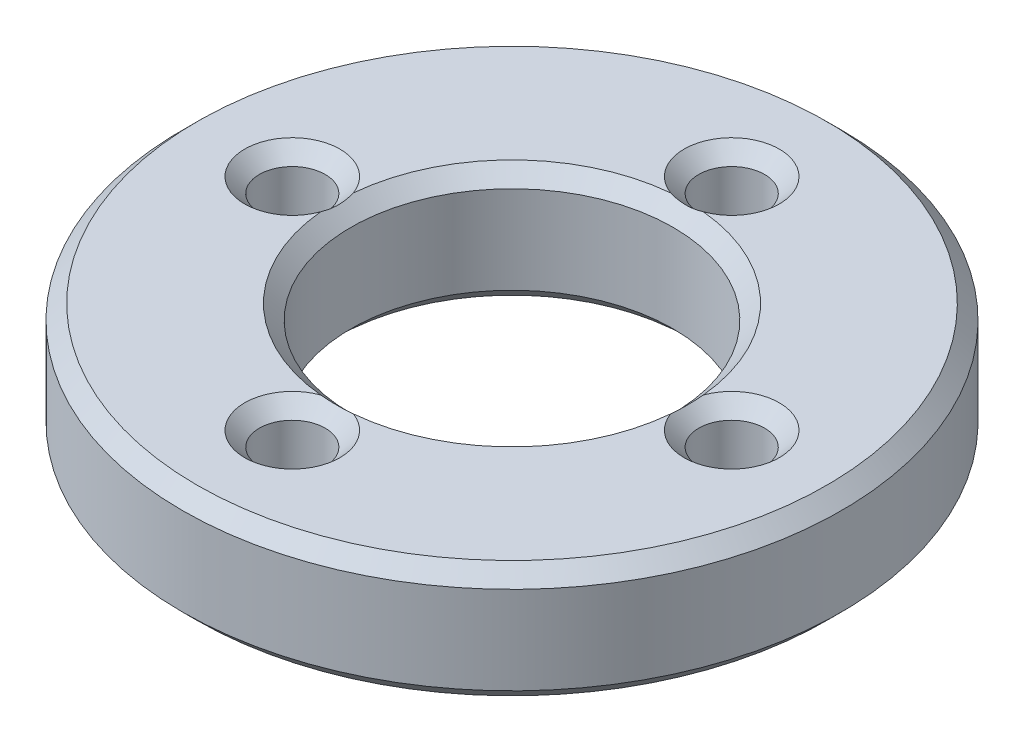
ISO-10303-21;
HEADER;
FILE_DESCRIPTION(('STEP AP214'),'2;1');
FILE_NAME('part.step','',(''),(''),'','','');
FILE_SCHEMA(('AUTOMOTIVE_DESIGN { 1 0 10303 214 1 1 1 1 }'));
ENDSEC;
DATA;
#1=APPLICATION_CONTEXT('core data for automotive mechanical design processes');
#2=APPLICATION_PROTOCOL_DEFINITION('international standard','automotive_design',2000,#1);
#3=PRODUCT_CONTEXT('',#1,'mechanical');
#4=PRODUCT('Part','Part','',(#3));
#5=PRODUCT_RELATED_PRODUCT_CATEGORY('part','',(#4));
#6=PRODUCT_DEFINITION_FORMATION('','',#4);
#7=PRODUCT_DEFINITION_CONTEXT('part definition',#1,'design');
#8=PRODUCT_DEFINITION('design','',#6,#7);
#9=PRODUCT_DEFINITION_SHAPE('','',#8);
#10=(LENGTH_UNIT() NAMED_UNIT(*) SI_UNIT(.MILLI.,.METRE.));
#11=(NAMED_UNIT(*) PLANE_ANGLE_UNIT() SI_UNIT($,.RADIAN.));
#12=(NAMED_UNIT(*) SI_UNIT($,.STERADIAN.) SOLID_ANGLE_UNIT());
#13=UNCERTAINTY_MEASURE_WITH_UNIT(LENGTH_MEASURE(1.E-05),#10,'distance_accuracy_value','');
#14=(GEOMETRIC_REPRESENTATION_CONTEXT(3) GLOBAL_UNCERTAINTY_ASSIGNED_CONTEXT((#13)) GLOBAL_UNIT_ASSIGNED_CONTEXT((#10,
#11,#12)) REPRESENTATION_CONTEXT('',''));
#15=CARTESIAN_POINT('',(0.,0.,0.));
#16=DIRECTION('',(0.,0.,1.));
#17=DIRECTION('',(1.,0.,0.));
#18=AXIS2_PLACEMENT_3D('',#15,#16,#17);
#19=CARTESIAN_POINT('',(0.,8.,0.));
#20=DIRECTION('',(0.,1.,0.));
#21=DIRECTION('',(0.,0.,1.));
#22=AXIS2_PLACEMENT_3D('',#19,#20,#21);
#23=PLANE('',#22);
#24=CARTESIAN_POINT('',(0.,8.,0.));
#25=DIRECTION('',(0.,1.,0.));
#26=DIRECTION('',(0.,0.,1.));
#27=AXIS2_PLACEMENT_3D('',#24,#25,#26);
#28=CIRCLE('',#27,21.5);
#29=CARTESIAN_POINT('',(0.,8.,21.5));
#30=VERTEX_POINT('',#29);
#31=EDGE_CURVE('E11',#30,#30,#28,.T.);
#32=ORIENTED_EDGE('',*,*,#31,.T.);
#33=EDGE_LOOP('',(#32));
#34=FACE_BOUND('',#33,.T.);
#35=CARTESIAN_POINT('',(15.,8.,0.));
#36=DIRECTION('',(0.,1.,0.));
#37=DIRECTION('',(0.,0.,1.));
#38=AXIS2_PLACEMENT_3D('',#35,#36,#37);
#39=CIRCLE('',#38,3.25);
#40=CARTESIAN_POINT('',(15.,8.,3.25));
#41=VERTEX_POINT('',#40);
#42=CARTESIAN_POINT('',(11.9479166666667,8.,1.11682018534268));
#43=VERTEX_POINT('',#42);
#44=EDGE_CURVE('E378',#41,#43,#39,.F.);
#45=ORIENTED_EDGE('',*,*,#44,.T.);
#46=CARTESIAN_POINT('',(0.,8.,0.));
#47=DIRECTION('',(0.,1.,0.));
#48=DIRECTION('',(0.,0.,1.));
#49=AXIS2_PLACEMENT_3D('',#46,#47,#48);
#50=CIRCLE('',#49,12.);
#51=CARTESIAN_POINT('',(1.11682018534268,8.,11.9479166666667));
#52=VERTEX_POINT('',#51);
#53=EDGE_CURVE('E57',#43,#52,#50,.F.);
#54=ORIENTED_EDGE('',*,*,#53,.T.);
#55=CARTESIAN_POINT('',(0.,8.,15.));
#56=DIRECTION('',(0.,1.,0.));
#57=DIRECTION('',(0.,0.,1.));
#58=AXIS2_PLACEMENT_3D('',#55,#56,#57);
#59=CIRCLE('',#58,3.25);
#60=CARTESIAN_POINT('',(0.,8.,18.25));
#61=VERTEX_POINT('',#60);
#62=EDGE_CURVE('E68',#52,#61,#59,.F.);
#63=ORIENTED_EDGE('',*,*,#62,.T.);
#64=CARTESIAN_POINT('',(0.,8.,15.));
#65=DIRECTION('',(0.,1.,0.));
#66=DIRECTION('',(0.,0.,1.));
#67=AXIS2_PLACEMENT_3D('',#64,#65,#66);
#68=CIRCLE('',#67,3.25);
#69=CARTESIAN_POINT('',(-1.11682018534267,8.,11.9479166666667));
#70=VERTEX_POINT('',#69);
#71=EDGE_CURVE('E381',#61,#70,#68,.F.);
#72=ORIENTED_EDGE('',*,*,#71,.T.);
#73=CARTESIAN_POINT('',(0.,8.,0.));
#74=DIRECTION('',(0.,1.,0.));
#75=DIRECTION('',(0.,0.,1.));
#76=AXIS2_PLACEMENT_3D('',#73,#74,#75);
#77=CIRCLE('',#76,12.);
#78=CARTESIAN_POINT('',(-11.9479166666667,8.,1.11682018534268));
#79=VERTEX_POINT('',#78);
#80=EDGE_CURVE('E375',#70,#79,#77,.F.);
#81=ORIENTED_EDGE('',*,*,#80,.T.);
#82=CARTESIAN_POINT('',(-15.,8.,0.));
#83=DIRECTION('',(0.,1.,0.));
#84=DIRECTION('',(0.,0.,1.));
#85=AXIS2_PLACEMENT_3D('',#82,#83,#84);
#86=CIRCLE('',#85,3.25);
#87=CARTESIAN_POINT('',(-15.,8.,3.25000000000001));
#88=VERTEX_POINT('',#87);
#89=EDGE_CURVE('E371',#79,#88,#86,.F.);
#90=ORIENTED_EDGE('',*,*,#89,.T.);
#91=CARTESIAN_POINT('',(-15.,8.,0.));
#92=DIRECTION('',(0.,1.,0.));
#93=DIRECTION('',(0.,0.,1.));
#94=AXIS2_PLACEMENT_3D('',#91,#92,#93);
#95=CIRCLE('',#94,3.25);
#96=CARTESIAN_POINT('',(-11.9479166666667,8.,-1.11682018534268));
#97=VERTEX_POINT('',#96);
#98=EDGE_CURVE('E368',#88,#97,#95,.F.);
#99=ORIENTED_EDGE('',*,*,#98,.T.);
#100=CARTESIAN_POINT('',(0.,8.,0.));
#101=DIRECTION('',(0.,1.,0.));
#102=DIRECTION('',(0.,0.,1.));
#103=AXIS2_PLACEMENT_3D('',#100,#101,#102);
#104=CIRCLE('',#103,12.);
#105=CARTESIAN_POINT('',(-1.11682018534268,8.,-11.9479166666667));
#106=VERTEX_POINT('',#105);
#107=EDGE_CURVE('E359',#97,#106,#104,.F.);
#108=ORIENTED_EDGE('',*,*,#107,.T.);
#109=CARTESIAN_POINT('',(0.,8.,-15.));
#110=DIRECTION('',(0.,1.,0.));
#111=DIRECTION('',(0.,0.,1.));
#112=AXIS2_PLACEMENT_3D('',#109,#110,#111);
#113=CIRCLE('',#112,3.25);
#114=CARTESIAN_POINT('',(1.11682018534267,8.,-11.9479166666667));
#115=VERTEX_POINT('',#114);
#116=EDGE_CURVE('E350',#106,#115,#113,.F.);
#117=ORIENTED_EDGE('',*,*,#116,.T.);
#118=CARTESIAN_POINT('',(0.,8.,0.));
#119=DIRECTION('',(0.,1.,0.));
#120=DIRECTION('',(0.,0.,1.));
#121=AXIS2_PLACEMENT_3D('',#118,#119,#120);
#122=CIRCLE('',#121,12.);
#123=CARTESIAN_POINT('',(11.9479166666667,8.,-1.11682018534269));
#124=VERTEX_POINT('',#123);
#125=EDGE_CURVE('E362',#115,#124,#122,.F.);
#126=ORIENTED_EDGE('',*,*,#125,.T.);
#127=CARTESIAN_POINT('',(15.,8.,0.));
#128=DIRECTION('',(0.,1.,0.));
#129=DIRECTION('',(0.,0.,1.));
#130=AXIS2_PLACEMENT_3D('',#127,#128,#129);
#131=CIRCLE('',#130,3.25);
#132=EDGE_CURVE('E365',#124,#41,#131,.F.);
#133=ORIENTED_EDGE('',*,*,#132,.T.);
#134=EDGE_LOOP('',(#45,#54,#63,#72,#81,#90,#99,#108,#117,#126,#133));
#135=FACE_BOUND('',#134,.T.);
#136=ADVANCED_FACE('F41',(#34,#135),#23,.T.);
#137=CARTESIAN_POINT('',(0.,0.,0.));
#138=DIRECTION('',(0.,1.,0.));
#139=DIRECTION('',(0.,0.,1.));
#140=AXIS2_PLACEMENT_3D('',#137,#138,#139);
#141=PLANE('',#140);
#142=CARTESIAN_POINT('',(0.,0.,0.));
#143=DIRECTION('',(0.,1.,0.));
#144=DIRECTION('',(0.,0.,1.));
#145=AXIS2_PLACEMENT_3D('',#142,#143,#144);
#146=CIRCLE('',#145,12.);
#147=CARTESIAN_POINT('',(1.11682018534268,0.,11.9479166666667));
#148=VERTEX_POINT('',#147);
#149=CARTESIAN_POINT('',(11.9479166666667,0.,1.11682018534267));
#150=VERTEX_POINT('',#149);
#151=EDGE_CURVE('E468',#148,#150,#146,.T.);
#152=ORIENTED_EDGE('',*,*,#151,.T.);
#153=CARTESIAN_POINT('',(15.,0.,0.));
#154=DIRECTION('',(0.,1.,0.));
#155=DIRECTION('',(0.,0.,1.));
#156=AXIS2_PLACEMENT_3D('',#153,#154,#155);
#157=CIRCLE('',#156,3.25);
#158=CARTESIAN_POINT('',(15.,0.,3.24999999999999));
#159=VERTEX_POINT('',#158);
#160=EDGE_CURVE('E409',#150,#159,#157,.T.);
#161=ORIENTED_EDGE('',*,*,#160,.T.);
#162=CARTESIAN_POINT('',(15.,0.,0.));
#163=DIRECTION('',(0.,1.,0.));
#164=DIRECTION('',(0.,0.,1.));
#165=AXIS2_PLACEMENT_3D('',#162,#163,#164);
#166=CIRCLE('',#165,3.25);
#167=CARTESIAN_POINT('',(11.9479166666667,0.,-1.11682018534268));
#168=VERTEX_POINT('',#167);
#169=EDGE_CURVE('E416',#159,#168,#166,.T.);
#170=ORIENTED_EDGE('',*,*,#169,.T.);
#171=CARTESIAN_POINT('',(0.,0.,0.));
#172=DIRECTION('',(0.,1.,0.));
#173=DIRECTION('',(0.,0.,1.));
#174=AXIS2_PLACEMENT_3D('',#171,#172,#173);
#175=CIRCLE('',#174,12.);
#176=CARTESIAN_POINT('',(1.11682018534267,0.,-11.9479166666667));
#177=VERTEX_POINT('',#176);
#178=EDGE_CURVE('E461',#168,#177,#175,.T.);
#179=ORIENTED_EDGE('',*,*,#178,.T.);
#180=CARTESIAN_POINT('',(0.,0.,-15.));
#181=DIRECTION('',(0.,1.,0.));
#182=DIRECTION('',(0.,0.,1.));
#183=AXIS2_PLACEMENT_3D('',#180,#181,#182);
#184=CIRCLE('',#183,3.25);
#185=CARTESIAN_POINT('',(-1.11682018534268,0.,-11.9479166666667));
#186=VERTEX_POINT('',#185);
#187=EDGE_CURVE('E456',#177,#186,#184,.T.);
#188=ORIENTED_EDGE('',*,*,#187,.T.);
#189=CARTESIAN_POINT('',(0.,0.,0.));
#190=DIRECTION('',(0.,1.,0.));
#191=DIRECTION('',(0.,0.,1.));
#192=AXIS2_PLACEMENT_3D('',#189,#190,#191);
#193=CIRCLE('',#192,12.);
#194=CARTESIAN_POINT('',(-11.9479166666667,0.,-1.11682018534268));
#195=VERTEX_POINT('',#194);
#196=EDGE_CURVE('E457',#186,#195,#193,.T.);
#197=ORIENTED_EDGE('',*,*,#196,.T.);
#198=CARTESIAN_POINT('',(-15.,0.,0.));
#199=DIRECTION('',(0.,1.,0.));
#200=DIRECTION('',(0.,0.,1.));
#201=AXIS2_PLACEMENT_3D('',#198,#199,#200);
#202=CIRCLE('',#201,3.25);
#203=CARTESIAN_POINT('',(-15.,0.,3.25));
#204=VERTEX_POINT('',#203);
#205=EDGE_CURVE('E136',#195,#204,#202,.T.);
#206=ORIENTED_EDGE('',*,*,#205,.T.);
#207=CARTESIAN_POINT('',(-15.,0.,0.));
#208=DIRECTION('',(0.,1.,0.));
#209=DIRECTION('',(0.,0.,1.));
#210=AXIS2_PLACEMENT_3D('',#207,#208,#209);
#211=CIRCLE('',#210,3.25);
#212=CARTESIAN_POINT('',(-11.9479166666667,0.,1.11682018534268));
#213=VERTEX_POINT('',#212);
#214=EDGE_CURVE('E129',#204,#213,#211,.T.);
#215=ORIENTED_EDGE('',*,*,#214,.T.);
#216=CARTESIAN_POINT('',(0.,0.,0.));
#217=DIRECTION('',(0.,1.,0.));
#218=DIRECTION('',(0.,0.,1.));
#219=AXIS2_PLACEMENT_3D('',#216,#217,#218);
#220=CIRCLE('',#219,12.);
#221=CARTESIAN_POINT('',(-1.11682018534268,0.,11.9479166666667));
#222=VERTEX_POINT('',#221);
#223=EDGE_CURVE('E133',#213,#222,#220,.T.);
#224=ORIENTED_EDGE('',*,*,#223,.T.);
#225=CARTESIAN_POINT('',(0.,0.,15.));
#226=DIRECTION('',(0.,1.,0.));
#227=DIRECTION('',(0.,0.,1.));
#228=AXIS2_PLACEMENT_3D('',#225,#226,#227);
#229=CIRCLE('',#228,3.25);
#230=CARTESIAN_POINT('',(0.,0.,18.25));
#231=VERTEX_POINT('',#230);
#232=EDGE_CURVE('E140',#222,#231,#229,.T.);
#233=ORIENTED_EDGE('',*,*,#232,.T.);
#234=CARTESIAN_POINT('',(0.,0.,15.));
#235=DIRECTION('',(0.,1.,0.));
#236=DIRECTION('',(0.,0.,1.));
#237=AXIS2_PLACEMENT_3D('',#234,#235,#236);
#238=CIRCLE('',#237,3.25);
#239=EDGE_CURVE('E454',#231,#148,#238,.T.);
#240=ORIENTED_EDGE('',*,*,#239,.T.);
#241=EDGE_LOOP('',(#152,#161,#170,#179,#188,#197,#206,#215,#224,#233,#240));
#242=FACE_BOUND('',#241,.T.);
#243=CARTESIAN_POINT('',(0.,0.,0.));
#244=DIRECTION('',(0.,1.,0.));
#245=DIRECTION('',(0.,0.,1.));
#246=AXIS2_PLACEMENT_3D('',#243,#244,#245);
#247=CIRCLE('',#246,21.5);
#248=CARTESIAN_POINT('',(0.,0.,21.5));
#249=VERTEX_POINT('',#248);
#250=EDGE_CURVE('E152',#249,#249,#247,.F.);
#251=ORIENTED_EDGE('',*,*,#250,.T.);
#252=EDGE_LOOP('',(#251));
#253=FACE_BOUND('',#252,.T.);
#254=ADVANCED_FACE('F131',(#242,#253),#141,.F.);
#255=CARTESIAN_POINT('',(0.,8.,0.));
#256=DIRECTION('',(0.,-1.,0.));
#257=DIRECTION('',(0.,0.,-1.));
#258=AXIS2_PLACEMENT_3D('',#255,#256,#257);
#259=CYLINDRICAL_SURFACE('',#258,22.5);
#260=CARTESIAN_POINT('',(0.,0.99999999999999,0.));
#261=DIRECTION('',(0.,1.,0.));
#262=DIRECTION('',(0.,0.,1.));
#263=AXIS2_PLACEMENT_3D('',#260,#261,#262);
#264=CIRCLE('',#263,22.5);
#265=CARTESIAN_POINT('',(0.,0.99999999999999,22.5));
#266=VERTEX_POINT('',#265);
#267=EDGE_CURVE('E340',#266,#266,#264,.T.);
#268=ORIENTED_EDGE('',*,*,#267,.T.);
#269=EDGE_LOOP('',(#268));
#270=FACE_BOUND('',#269,.T.);
#271=CARTESIAN_POINT('',(0.,6.99999999999999,0.));
#272=DIRECTION('',(0.,1.,0.));
#273=DIRECTION('',(0.,0.,1.));
#274=AXIS2_PLACEMENT_3D('',#271,#272,#273);
#275=CIRCLE('',#274,22.5);
#276=CARTESIAN_POINT('',(0.,6.99999999999999,22.5));
#277=VERTEX_POINT('',#276);
#278=EDGE_CURVE('E343',#277,#277,#275,.F.);
#279=ORIENTED_EDGE('',*,*,#278,.T.);
#280=EDGE_LOOP('',(#279));
#281=FACE_BOUND('',#280,.T.);
#282=ADVANCED_FACE('F325',(#270,#281),#259,.T.);
#283=CARTESIAN_POINT('',(0.,8.,0.));
#284=DIRECTION('',(0.,-1.,0.));
#285=DIRECTION('',(0.,0.,-1.));
#286=AXIS2_PLACEMENT_3D('',#283,#284,#285);
#287=CYLINDRICAL_SURFACE('',#286,11.);
#288=CARTESIAN_POINT('',(0.,1.,0.));
#289=DIRECTION('',(0.,1.,0.));
#290=DIRECTION('',(0.,0.,1.));
#291=AXIS2_PLACEMENT_3D('',#288,#289,#290);
#292=CIRCLE('',#291,11.);
#293=CARTESIAN_POINT('',(0.,1.,11.));
#294=VERTEX_POINT('',#293);
#295=EDGE_CURVE('E346',#294,#294,#292,.F.);
#296=ORIENTED_EDGE('',*,*,#295,.T.);
#297=EDGE_LOOP('',(#296));
#298=FACE_BOUND('',#297,.T.);
#299=CARTESIAN_POINT('',(0.,7.00000000000001,0.));
#300=DIRECTION('',(0.,1.,0.));
#301=DIRECTION('',(0.,0.,1.));
#302=AXIS2_PLACEMENT_3D('',#299,#300,#301);
#303=CIRCLE('',#302,11.);
#304=CARTESIAN_POINT('',(0.,7.00000000000001,11.));
#305=VERTEX_POINT('',#304);
#306=EDGE_CURVE('E353',#305,#305,#303,.T.);
#307=ORIENTED_EDGE('',*,*,#306,.T.);
#308=EDGE_LOOP('',(#307));
#309=FACE_BOUND('',#308,.T.);
#310=ADVANCED_FACE('F328',(#298,#309),#287,.F.);
#311=CARTESIAN_POINT('',(0.,8.,15.));
#312=DIRECTION('',(0.,-1.,0.));
#313=DIRECTION('',(0.,0.,-1.));
#314=AXIS2_PLACEMENT_3D('',#311,#312,#313);
#315=CYLINDRICAL_SURFACE('',#314,2.25);
#316=CARTESIAN_POINT('',(0.,0.999999999999996,15.));
#317=DIRECTION('',(0.,1.,0.));
#318=DIRECTION('',(0.,0.,1.));
#319=AXIS2_PLACEMENT_3D('',#316,#317,#318);
#320=CIRCLE('',#319,2.25);
#321=CARTESIAN_POINT('',(0.,0.999999999999996,17.25));
#322=VERTEX_POINT('',#321);
#323=EDGE_CURVE('E439',#322,#322,#320,.F.);
#324=ORIENTED_EDGE('',*,*,#323,.T.);
#325=EDGE_LOOP('',(#324));
#326=FACE_BOUND('',#325,.T.);
#327=CARTESIAN_POINT('',(0.,7.,15.));
#328=DIRECTION('',(0.,1.,0.));
#329=DIRECTION('',(0.,0.,1.));
#330=AXIS2_PLACEMENT_3D('',#327,#328,#329);
#331=CIRCLE('',#330,2.25);
#332=CARTESIAN_POINT('',(0.,7.,17.25));
#333=VERTEX_POINT('',#332);
#334=EDGE_CURVE('E435',#333,#333,#331,.T.);
#335=ORIENTED_EDGE('',*,*,#334,.T.);
#336=EDGE_LOOP('',(#335));
#337=FACE_BOUND('',#336,.T.);
#338=ADVANCED_FACE('F335',(#326,#337),#315,.F.);
#339=CARTESIAN_POINT('',(15.,8.,0.));
#340=DIRECTION('',(0.,-1.,0.));
#341=DIRECTION('',(0.,0.,-1.));
#342=AXIS2_PLACEMENT_3D('',#339,#340,#341);
#343=CYLINDRICAL_SURFACE('',#342,2.25);
#344=CARTESIAN_POINT('',(15.,0.999999999999992,0.));
#345=DIRECTION('',(0.,1.,0.));
#346=DIRECTION('',(0.,0.,1.));
#347=AXIS2_PLACEMENT_3D('',#344,#345,#346);
#348=CIRCLE('',#347,2.25);
#349=CARTESIAN_POINT('',(15.,0.999999999999992,2.25));
#350=VERTEX_POINT('',#349);
#351=EDGE_CURVE('E431',#350,#350,#348,.F.);
#352=ORIENTED_EDGE('',*,*,#351,.T.);
#353=EDGE_LOOP('',(#352));
#354=FACE_BOUND('',#353,.T.);
#355=CARTESIAN_POINT('',(15.,7.00000000000001,0.));
#356=DIRECTION('',(0.,1.,0.));
#357=DIRECTION('',(0.,0.,1.));
#358=AXIS2_PLACEMENT_3D('',#355,#356,#357);
#359=CIRCLE('',#358,2.25);
#360=CARTESIAN_POINT('',(15.,7.00000000000001,2.25));
#361=VERTEX_POINT('',#360);
#362=EDGE_CURVE('E427',#361,#361,#359,.T.);
#363=ORIENTED_EDGE('',*,*,#362,.T.);
#364=EDGE_LOOP('',(#363));
#365=FACE_BOUND('',#364,.T.);
#366=ADVANCED_FACE('F496',(#354,#365),#343,.F.);
#367=CARTESIAN_POINT('',(0.,8.,-15.));
#368=DIRECTION('',(0.,-1.,0.));
#369=DIRECTION('',(0.,0.,-1.));
#370=AXIS2_PLACEMENT_3D('',#367,#368,#369);
#371=CYLINDRICAL_SURFACE('',#370,2.25);
#372=CARTESIAN_POINT('',(0.,0.999999999999996,-15.));
#373=DIRECTION('',(0.,1.,0.));
#374=DIRECTION('',(0.,0.,1.));
#375=AXIS2_PLACEMENT_3D('',#372,#373,#374);
#376=CIRCLE('',#375,2.25);
#377=CARTESIAN_POINT('',(0.,0.999999999999996,-12.75));
#378=VERTEX_POINT('',#377);
#379=EDGE_CURVE('E423',#378,#378,#376,.F.);
#380=ORIENTED_EDGE('',*,*,#379,.T.);
#381=EDGE_LOOP('',(#380));
#382=FACE_BOUND('',#381,.T.);
#383=CARTESIAN_POINT('',(0.,7.,-15.));
#384=DIRECTION('',(0.,1.,0.));
#385=DIRECTION('',(0.,0.,1.));
#386=AXIS2_PLACEMENT_3D('',#383,#384,#385);
#387=CIRCLE('',#386,2.25);
#388=CARTESIAN_POINT('',(0.,7.,-12.75));
#389=VERTEX_POINT('',#388);
#390=EDGE_CURVE('E414',#389,#389,#387,.T.);
#391=ORIENTED_EDGE('',*,*,#390,.T.);
#392=EDGE_LOOP('',(#391));
#393=FACE_BOUND('',#392,.T.);
#394=ADVANCED_FACE('F490',(#382,#393),#371,.F.);
#395=CARTESIAN_POINT('',(-15.,8.,0.));
#396=DIRECTION('',(0.,-1.,0.));
#397=DIRECTION('',(0.,0.,-1.));
#398=AXIS2_PLACEMENT_3D('',#395,#396,#397);
#399=CYLINDRICAL_SURFACE('',#398,2.25);
#400=CARTESIAN_POINT('',(-15.,0.999999999999994,0.));
#401=DIRECTION('',(0.,1.,0.));
#402=DIRECTION('',(0.,0.,1.));
#403=AXIS2_PLACEMENT_3D('',#400,#401,#402);
#404=CIRCLE('',#403,2.25);
#405=CARTESIAN_POINT('',(-15.,0.999999999999994,2.25));
#406=VERTEX_POINT('',#405);
#407=EDGE_CURVE('E408',#406,#406,#404,.F.);
#408=ORIENTED_EDGE('',*,*,#407,.T.);
#409=EDGE_LOOP('',(#408));
#410=FACE_BOUND('',#409,.T.);
#411=CARTESIAN_POINT('',(-15.,7.,0.));
#412=DIRECTION('',(0.,1.,0.));
#413=DIRECTION('',(0.,0.,1.));
#414=AXIS2_PLACEMENT_3D('',#411,#412,#413);
#415=CIRCLE('',#414,2.25);
#416=CARTESIAN_POINT('',(-15.,7.,2.25));
#417=VERTEX_POINT('',#416);
#418=EDGE_CURVE('E405',#417,#417,#415,.T.);
#419=ORIENTED_EDGE('',*,*,#418,.T.);
#420=EDGE_LOOP('',(#419));
#421=FACE_BOUND('',#420,.T.);
#422=ADVANCED_FACE('F452',(#410,#421),#399,.F.);
#423=CARTESIAN_POINT('',(0.,0.,15.));
#424=DIRECTION('',(0.,-1.,0.));
#425=DIRECTION('',(0.,0.,-1.));
#426=AXIS2_PLACEMENT_3D('',#423,#424,#425);
#427=CONICAL_SURFACE('',#426,3.25,0.785398163397449);
#428=ORIENTED_EDGE('',*,*,#323,.F.);
#429=EDGE_LOOP('',(#428));
#430=FACE_BOUND('',#429,.T.);
#431=ORIENTED_EDGE('',*,*,#239,.F.);
#432=ORIENTED_EDGE('',*,*,#232,.F.);
#433=CARTESIAN_POINT('',(-1.11772067420977,-0.000200000000043536,11.9480333333334));
#434=CARTESIAN_POINT('',(-1.05539175424125,0.0136497580904307,11.9399543075761));
#435=CARTESIAN_POINT('',(-0.992753424301056,0.0264449954982446,11.9324904191515));
#436=CARTESIAN_POINT('',(-0.866915836445238,0.0498224222767393,11.9188535871498));
#437=CARTESIAN_POINT('',(-0.803716489536559,0.0604042537549872,11.9126808523432));
#438=CARTESIAN_POINT('',(-0.613342650175298,0.0886750013638216,11.8961895832452));
#439=CARTESIAN_POINT('',(-0.485443096378168,0.10287774801683,11.8879046474885));
#440=CARTESIAN_POINT('',(-0.231490184338979,0.121174878158611,11.8772313212356));
#441=CARTESIAN_POINT('',(-0.105457135288016,0.12548229622541,11.8747186605673));
#442=CARTESIAN_POINT('',(0.146494580858252,0.124432615300888,11.8753309743758));
#443=CARTESIAN_POINT('',(0.272413269223022,0.119081762900274,11.8784523050079));
#444=CARTESIAN_POINT('',(0.458190197260992,0.104182760083777,11.8871433899352));
#445=CARTESIAN_POINT('',(0.518466641439689,0.0982467047465003,11.8906060888432));
#446=CARTESIAN_POINT('',(0.638681878995019,0.0842508136073562,11.8987703587847));
#447=CARTESIAN_POINT('',(0.69862071158409,0.0761912298672786,11.903471782782));
#448=CARTESIAN_POINT('',(0.879085995960475,0.0487490696194776,11.9194797099903));
#449=CARTESIAN_POINT('',(0.998982108621678,0.0262079895936793,11.9326286735329));
#450=CARTESIAN_POINT('',(1.11772067420978,-0.000200000000040899,11.9480333333334));
#451=B_SPLINE_CURVE_WITH_KNOTS('',3,(#433,#434,#435,#436,#437,#438,#439,#440,#441,#442,#443,
#444,#445,#446,#447,#448,#449,#450),.UNSPECIFIED.,.F.,.F.,(4,2,2,2,2,2,2,2,4),(0.,
0.193050928420624,0.386133047752692,0.772454092873525,1.1503768696363,1.52805530833849,
1.71001363912299,1.89195038126466,2.25966691099102),.UNSPECIFIED.);
#452=EDGE_CURVE('E150',#148,#222,#451,.F.);
#453=ORIENTED_EDGE('',*,*,#452,.F.);
#454=EDGE_LOOP('',(#431,#432,#453));
#455=FACE_BOUND('',#454,.T.);
#456=ADVANCED_FACE('F215',(#430,#455),#427,.F.);
#457=CARTESIAN_POINT('',(15.,0.,0.));
#458=DIRECTION('',(0.,-1.,0.));
#459=DIRECTION('',(0.,0.,-1.));
#460=AXIS2_PLACEMENT_3D('',#457,#458,#459);
#461=CONICAL_SURFACE('',#460,3.25,0.785398163397449);
#462=ORIENTED_EDGE('',*,*,#351,.F.);
#463=EDGE_LOOP('',(#462));
#464=FACE_BOUND('',#463,.T.);
#465=ORIENTED_EDGE('',*,*,#169,.F.);
#466=ORIENTED_EDGE('',*,*,#160,.F.);
#467=CARTESIAN_POINT('',(11.9480333333334,-0.000200000000045619,1.11772067420978));
#468=CARTESIAN_POINT('',(11.9399543075761,0.0136497580904288,1.05539175424125));
#469=CARTESIAN_POINT('',(11.9324904191515,0.0264449954982429,0.992753424301061));
#470=CARTESIAN_POINT('',(11.9188535871498,0.049822422276738,0.866915836445244));
#471=CARTESIAN_POINT('',(11.9126808523432,0.060404253754986,0.803716489536564));
#472=CARTESIAN_POINT('',(11.8961895832452,0.0886750013638206,0.613342650175304));
#473=CARTESIAN_POINT('',(11.8879046474885,0.102877748016829,0.485443096378173));
#474=CARTESIAN_POINT('',(11.8772313212356,0.121174878158611,0.231490184338984));
#475=CARTESIAN_POINT('',(11.8747186605673,0.12548229622541,0.10545713528802));
#476=CARTESIAN_POINT('',(11.8753309743758,0.124432615300889,-0.146494580858248));
#477=CARTESIAN_POINT('',(11.8784523050079,0.119081762900274,-0.272413269223019));
#478=CARTESIAN_POINT('',(11.8871433899352,0.104182760083778,-0.458190197260989));
#479=CARTESIAN_POINT('',(11.8906060888432,0.0982467047465015,-0.518466641439687));
#480=CARTESIAN_POINT('',(11.8987703587847,0.0842508136073574,-0.638681878995018));
#481=CARTESIAN_POINT('',(11.903471782782,0.0761912298672794,-0.69862071158409));
#482=CARTESIAN_POINT('',(11.9194797099903,0.0487490696194767,-0.879085995960476));
#483=CARTESIAN_POINT('',(11.9326286735329,0.0262079895936767,-0.998982108621681));
#484=CARTESIAN_POINT('',(11.9480333333334,-0.000200000000041956,-1.11772067420979));
#485=B_SPLINE_CURVE_WITH_KNOTS('',3,(#467,#468,#469,#470,#471,#472,#473,#474,#475,#476,#477,
#478,#479,#480,#481,#482,#483,#484),.UNSPECIFIED.,.F.,.F.,(4,2,2,2,2,2,2,2,4),(0.,
0.193050928420624,0.386133047752693,0.772454092873526,1.15037686963631,1.52805530833849,
1.71001363912299,1.89195038126466,2.25966691099103),.UNSPECIFIED.);
#486=EDGE_CURVE('E161',#168,#150,#485,.F.);
#487=ORIENTED_EDGE('',*,*,#486,.F.);
#488=EDGE_LOOP('',(#465,#466,#487));
#489=FACE_BOUND('',#488,.T.);
#490=ADVANCED_FACE('F202',(#464,#489),#461,.F.);
#491=CARTESIAN_POINT('',(0.,0.,-15.));
#492=DIRECTION('',(0.,-1.,0.));
#493=DIRECTION('',(0.,0.,-1.));
#494=AXIS2_PLACEMENT_3D('',#491,#492,#493);
#495=CONICAL_SURFACE('',#494,3.25,0.785398163397449);
#496=ORIENTED_EDGE('',*,*,#379,.F.);
#497=EDGE_LOOP('',(#496));
#498=FACE_BOUND('',#497,.T.);
#499=CARTESIAN_POINT('',(1.11772067420978,-0.000200000000045619,-11.9480333333334));
#500=CARTESIAN_POINT('',(1.05539175424125,0.0136497580904289,-11.9399543075761));
#501=CARTESIAN_POINT('',(0.99275342430106,0.026444995498243,-11.9324904191515));
#502=CARTESIAN_POINT('',(0.866915836445243,0.0498224222767382,-11.9188535871498));
#503=CARTESIAN_POINT('',(0.803716489536564,0.0604042537549863,-11.9126808523432));
#504=CARTESIAN_POINT('',(0.613342650175303,0.0886750013638208,-11.8961895832452));
#505=CARTESIAN_POINT('',(0.485443096378172,0.102877748016829,-11.8879046474885));
#506=CARTESIAN_POINT('',(0.231490184338983,0.121174878158611,-11.8772313212356));
#507=CARTESIAN_POINT('',(0.105457135288019,0.12548229622541,-11.8747186605673));
#508=CARTESIAN_POINT('',(-0.146494580858249,0.124432615300889,-11.8753309743758));
#509=CARTESIAN_POINT('',(-0.27241326922302,0.119081762900274,-11.8784523050079));
#510=CARTESIAN_POINT('',(-0.45819019726099,0.104182760083777,-11.8871433899352));
#511=CARTESIAN_POINT('',(-0.518466641439688,0.0982467047465005,-11.8906060888432));
#512=CARTESIAN_POINT('',(-0.638681878995019,0.0842508136073564,-11.8987703587847));
#513=CARTESIAN_POINT('',(-0.698620711584091,0.0761912298672788,-11.903471782782));
#514=CARTESIAN_POINT('',(-0.879085995960477,0.0487490696194778,-11.9194797099903));
#515=CARTESIAN_POINT('',(-0.998982108621682,0.0262079895936791,-11.9326286735329));
#516=CARTESIAN_POINT('',(-1.11772067420979,-0.000200000000041956,-11.9480333333334));
#517=B_SPLINE_CURVE_WITH_KNOTS('',3,(#499,#500,#501,#502,#503,#504,#505,#506,#507,#508,#509,
#510,#511,#512,#513,#514,#515,#516),.UNSPECIFIED.,.F.,.F.,(4,2,2,2,2,2,2,2,4),(0.,
0.193050928420624,0.386133047752693,0.772454092873526,1.15037686963631,1.52805530833849,
1.71001363912299,1.89195038126466,2.25966691099103),.UNSPECIFIED.);
#518=EDGE_CURVE('E156',#186,#177,#517,.F.);
#519=ORIENTED_EDGE('',*,*,#518,.F.);
#520=ORIENTED_EDGE('',*,*,#187,.F.);
#521=EDGE_LOOP('',(#519,#520));
#522=FACE_BOUND('',#521,.T.);
#523=ADVANCED_FACE('F189',(#498,#522),#495,.F.);
#524=CARTESIAN_POINT('',(0.,0.,0.));
#525=DIRECTION('',(0.,-1.,0.));
#526=DIRECTION('',(0.,0.,-1.));
#527=AXIS2_PLACEMENT_3D('',#524,#525,#526);
#528=CONICAL_SURFACE('',#527,12.,0.785398163397447);
#529=ORIENTED_EDGE('',*,*,#295,.F.);
#530=EDGE_LOOP('',(#529));
#531=FACE_BOUND('',#530,.T.);
#532=CARTESIAN_POINT('',(-11.9480333333334,-0.000200000000043743,-1.11772067420977));
#533=CARTESIAN_POINT('',(-11.9399543075761,0.0136497580904306,-1.05539175424125));
#534=CARTESIAN_POINT('',(-11.9324904191515,0.0264449954982445,-0.992753424301056));
#535=CARTESIAN_POINT('',(-11.9188535871498,0.0498224222767393,-0.866915836445238));
#536=CARTESIAN_POINT('',(-11.9126808523432,0.0604042537549872,-0.803716489536559));
#537=CARTESIAN_POINT('',(-11.8961895832452,0.0886750013638215,-0.613342650175298));
#538=CARTESIAN_POINT('',(-11.8879046474885,0.102877748016829,-0.485443096378168));
#539=CARTESIAN_POINT('',(-11.8772313212356,0.121174878158611,-0.231490184338979));
#540=CARTESIAN_POINT('',(-11.8747186605673,0.125482296225411,-0.105457135288015));
#541=CARTESIAN_POINT('',(-11.8753309743758,0.124432615300889,0.146494580858253));
#542=CARTESIAN_POINT('',(-11.8784523050079,0.119081762900273,0.272413269223023));
#543=CARTESIAN_POINT('',(-11.8871433899352,0.104182760083777,0.458190197260993));
#544=CARTESIAN_POINT('',(-11.8906060888432,0.0982467047465008,0.51846664143969));
#545=CARTESIAN_POINT('',(-11.8987703587847,0.0842508136073568,0.63868187899502));
#546=CARTESIAN_POINT('',(-11.903471782782,0.0761912298672788,0.698620711584091));
#547=CARTESIAN_POINT('',(-11.9194797099903,0.0487490696194764,0.879085995960475));
#548=CARTESIAN_POINT('',(-11.9326286735329,0.0262079895936769,0.998982108621678));
#549=CARTESIAN_POINT('',(-11.9480333333334,-0.000200000000040898,1.11772067420978));
#550=B_SPLINE_CURVE_WITH_KNOTS('',3,(#532,#533,#534,#535,#536,#537,#538,#539,#540,#541,#542,
#543,#544,#545,#546,#547,#548,#549),.UNSPECIFIED.,.F.,.F.,(4,2,2,2,2,2,2,2,4),(0.,
0.193050928420624,0.386133047752692,0.772454092873526,1.1503768696363,1.52805530833849,
1.71001363912299,1.89195038126466,2.25966691099103),.UNSPECIFIED.);
#551=EDGE_CURVE('E147',#195,#213,#550,.T.);
#552=ORIENTED_EDGE('',*,*,#551,.F.);
#553=ORIENTED_EDGE('',*,*,#196,.F.);
#554=ORIENTED_EDGE('',*,*,#518,.T.);
#555=ORIENTED_EDGE('',*,*,#178,.F.);
#556=ORIENTED_EDGE('',*,*,#486,.T.);
#557=ORIENTED_EDGE('',*,*,#151,.F.);
#558=ORIENTED_EDGE('',*,*,#452,.T.);
#559=ORIENTED_EDGE('',*,*,#223,.F.);
#560=EDGE_LOOP('',(#552,#553,#554,#555,#556,#557,#558,#559));
#561=FACE_BOUND('',#560,.T.);
#562=ADVANCED_FACE('F145',(#531,#561),#528,.F.);
#563=CARTESIAN_POINT('',(-15.,0.,0.));
#564=DIRECTION('',(0.,-1.,0.));
#565=DIRECTION('',(0.,0.,-1.));
#566=AXIS2_PLACEMENT_3D('',#563,#564,#565);
#567=CONICAL_SURFACE('',#566,3.25,0.785398163397449);
#568=ORIENTED_EDGE('',*,*,#407,.F.);
#569=EDGE_LOOP('',(#568));
#570=FACE_BOUND('',#569,.T.);
#571=ORIENTED_EDGE('',*,*,#205,.F.);
#572=ORIENTED_EDGE('',*,*,#551,.T.);
#573=ORIENTED_EDGE('',*,*,#214,.F.);
#574=EDGE_LOOP('',(#571,#572,#573));
#575=FACE_BOUND('',#574,.T.);
#576=ADVANCED_FACE('F154',(#570,#575),#567,.F.);
#577=CARTESIAN_POINT('',(0.,0.99999999999999,0.));
#578=DIRECTION('',(0.,1.,0.));
#579=DIRECTION('',(0.,0.,1.));
#580=AXIS2_PLACEMENT_3D('',#577,#578,#579);
#581=CONICAL_SURFACE('',#580,22.5,0.785398163397454);
#582=ORIENTED_EDGE('',*,*,#250,.F.);
#583=EDGE_LOOP('',(#582));
#584=FACE_BOUND('',#583,.T.);
#585=ORIENTED_EDGE('',*,*,#267,.F.);
#586=EDGE_LOOP('',(#585));
#587=FACE_BOUND('',#586,.T.);
#588=ADVANCED_FACE('F195',(#584,#587),#581,.T.);
#589=CARTESIAN_POINT('',(0.,7.,-15.));
#590=DIRECTION('',(0.,1.,0.));
#591=DIRECTION('',(0.,0.,1.));
#592=AXIS2_PLACEMENT_3D('',#589,#590,#591);
#593=CONICAL_SURFACE('',#592,2.25,0.785398163397451);
#594=ORIENTED_EDGE('',*,*,#390,.F.);
#595=EDGE_LOOP('',(#594));
#596=FACE_BOUND('',#595,.T.);
#597=CARTESIAN_POINT('',(1.11772067420978,8.00020000000005,-11.9480333333334));
#598=CARTESIAN_POINT('',(1.05539175424125,7.98635024190957,-11.9399543075761));
#599=CARTESIAN_POINT('',(0.992753424301062,7.97355500450176,-11.9324904191515));
#600=CARTESIAN_POINT('',(0.866915836445244,7.95017757772326,-11.9188535871498));
#601=CARTESIAN_POINT('',(0.803716489536564,7.93959574624501,-11.9126808523432));
#602=CARTESIAN_POINT('',(0.613342650175302,7.91132499863618,-11.8961895832452));
#603=CARTESIAN_POINT('',(0.485443096378171,7.89712225198317,-11.8879046474885));
#604=CARTESIAN_POINT('',(0.231490184338979,7.87882512184139,-11.8772313212356));
#605=CARTESIAN_POINT('',(0.105457135288015,7.87451770377459,-11.8747186605673));
#606=CARTESIAN_POINT('',(-0.146494580858255,7.87556738469911,-11.8753309743758));
#607=CARTESIAN_POINT('',(-0.272413269223026,7.88091823709973,-11.8784523050079));
#608=CARTESIAN_POINT('',(-0.458190197260997,7.89581723991622,-11.8871433899352));
#609=CARTESIAN_POINT('',(-0.518466641439694,7.9017532952535,-11.8906060888432));
#610=CARTESIAN_POINT('',(-0.638681878995024,7.91574918639264,-11.8987703587846));
#611=CARTESIAN_POINT('',(-0.698620711584096,7.92380877013272,-11.9034717827819));
#612=CARTESIAN_POINT('',(-0.87908599596048,7.95125093038052,-11.9194797099903));
#613=CARTESIAN_POINT('',(-0.998982108621683,7.97379201040632,-11.9326286735329));
#614=CARTESIAN_POINT('',(-1.11772067420979,8.00020000000004,-11.9480333333334));
#615=B_SPLINE_CURVE_WITH_KNOTS('',3,(#597,#598,#599,#600,#601,#602,#603,#604,#605,#606,#607,
#608,#609,#610,#611,#612,#613,#614),.UNSPECIFIED.,.F.,.F.,(4,2,2,2,2,2,2,2,4),(0.,
0.193050928420625,0.386133047752695,0.772454092873531,1.15037686963631,1.5280553083385,
1.710013639123,1.89195038126467,2.25966691099104),.UNSPECIFIED.);
#616=EDGE_CURVE('E46',#115,#106,#615,.T.);
#617=ORIENTED_EDGE('',*,*,#616,.F.);
#618=ORIENTED_EDGE('',*,*,#116,.F.);
#619=EDGE_LOOP('',(#617,#618));
#620=FACE_BOUND('',#619,.T.);
#621=ADVANCED_FACE('F253',(#596,#620),#593,.F.);
#622=CARTESIAN_POINT('',(15.,7.00000000000001,0.));
#623=DIRECTION('',(0.,1.,0.));
#624=DIRECTION('',(0.,0.,1.));
#625=AXIS2_PLACEMENT_3D('',#622,#623,#624);
#626=CONICAL_SURFACE('',#625,2.25,0.785398163397451);
#627=ORIENTED_EDGE('',*,*,#362,.F.);
#628=EDGE_LOOP('',(#627));
#629=FACE_BOUND('',#628,.T.);
#630=ORIENTED_EDGE('',*,*,#44,.F.);
#631=ORIENTED_EDGE('',*,*,#132,.F.);
#632=CARTESIAN_POINT('',(11.9480333333333,8.00020000000005,-1.11772067420979));
#633=CARTESIAN_POINT('',(11.9399543075761,7.98635024190957,-1.05539175424126));
#634=CARTESIAN_POINT('',(11.9324904191515,7.97355500450176,-0.992753424301068));
#635=CARTESIAN_POINT('',(11.9188535871498,7.95017757772326,-0.866915836445249));
#636=CARTESIAN_POINT('',(11.9126808523432,7.93959574624501,-0.80371648953657));
#637=CARTESIAN_POINT('',(11.8961895832452,7.91132499863618,-0.613342650175308));
#638=CARTESIAN_POINT('',(11.8879046474885,7.89712225198317,-0.485443096378177));
#639=CARTESIAN_POINT('',(11.8772313212356,7.87882512184139,-0.231490184338986));
#640=CARTESIAN_POINT('',(11.8747186605673,7.87451770377459,-0.105457135288022));
#641=CARTESIAN_POINT('',(11.8753309743758,7.87556738469911,0.146494580858248));
#642=CARTESIAN_POINT('',(11.8784523050079,7.88091823709973,0.272413269223019));
#643=CARTESIAN_POINT('',(11.8871433899352,7.89581723991622,0.458190197260989));
#644=CARTESIAN_POINT('',(11.8906060888432,7.9017532952535,0.518466641439687));
#645=CARTESIAN_POINT('',(11.8987703587846,7.91574918639265,0.638681878995017));
#646=CARTESIAN_POINT('',(11.9034717827819,7.92380877013272,0.698620711584089));
#647=CARTESIAN_POINT('',(11.9194797099903,7.95125093038052,0.879085995960473));
#648=CARTESIAN_POINT('',(11.9326286735329,7.97379201040632,0.998982108621677));
#649=CARTESIAN_POINT('',(11.9480333333334,8.00020000000004,1.11772067420978));
#650=B_SPLINE_CURVE_WITH_KNOTS('',3,(#632,#633,#634,#635,#636,#637,#638,#639,#640,#641,#642,
#643,#644,#645,#646,#647,#648,#649),.UNSPECIFIED.,.F.,.F.,(4,2,2,2,2,2,2,2,4),(0.,
0.193050928420625,0.386133047752696,0.772454092873531,1.15037686963631,1.5280553083385,
1.710013639123,1.89195038126467,2.25966691099104),.UNSPECIFIED.);
#651=EDGE_CURVE('E164',#43,#124,#650,.F.);
#652=ORIENTED_EDGE('',*,*,#651,.F.);
#653=EDGE_LOOP('',(#630,#631,#652));
#654=FACE_BOUND('',#653,.T.);
#655=ADVANCED_FACE('F298',(#629,#654),#626,.F.);
#656=CARTESIAN_POINT('',(0.,7.,15.));
#657=DIRECTION('',(0.,1.,0.));
#658=DIRECTION('',(0.,0.,1.));
#659=AXIS2_PLACEMENT_3D('',#656,#657,#658);
#660=CONICAL_SURFACE('',#659,2.25,0.785398163397451);
#661=ORIENTED_EDGE('',*,*,#334,.F.);
#662=EDGE_LOOP('',(#661));
#663=FACE_BOUND('',#662,.T.);
#664=ORIENTED_EDGE('',*,*,#71,.F.);
#665=ORIENTED_EDGE('',*,*,#62,.F.);
#666=CARTESIAN_POINT('',(-1.11772067420978,8.00020000000005,11.9480333333333));
#667=CARTESIAN_POINT('',(-1.05539175424125,7.98635024190957,11.9399543075761));
#668=CARTESIAN_POINT('',(-0.992753424301059,7.97355500450176,11.9324904191515));
#669=CARTESIAN_POINT('',(-0.866915836445241,7.95017757772326,11.9188535871498));
#670=CARTESIAN_POINT('',(-0.803716489536562,7.93959574624501,11.9126808523432));
#671=CARTESIAN_POINT('',(-0.6133426501753,7.91132499863618,11.8961895832452));
#672=CARTESIAN_POINT('',(-0.485443096378169,7.89712225198317,11.8879046474885));
#673=CARTESIAN_POINT('',(-0.231490184338978,7.87882512184139,11.8772313212356));
#674=CARTESIAN_POINT('',(-0.105457135288014,7.87451770377459,11.8747186605673));
#675=CARTESIAN_POINT('',(0.146494580858256,7.87556738469911,11.8753309743758));
#676=CARTESIAN_POINT('',(0.272413269223027,7.88091823709973,11.8784523050079));
#677=CARTESIAN_POINT('',(0.458190197260998,7.89581723991622,11.8871433899352));
#678=CARTESIAN_POINT('',(0.518466641439696,7.9017532952535,11.8906060888432));
#679=CARTESIAN_POINT('',(0.638681878995027,7.91574918639265,11.8987703587846));
#680=CARTESIAN_POINT('',(0.698620711584098,7.92380877013272,11.9034717827819));
#681=CARTESIAN_POINT('',(0.879085995960484,7.95125093038052,11.9194797099903));
#682=CARTESIAN_POINT('',(0.998982108621689,7.97379201040632,11.9326286735329));
#683=CARTESIAN_POINT('',(1.11772067420979,8.00020000000004,11.9480333333334));
#684=B_SPLINE_CURVE_WITH_KNOTS('',3,(#666,#667,#668,#669,#670,#671,#672,#673,#674,#675,#676,
#677,#678,#679,#680,#681,#682,#683),.UNSPECIFIED.,.F.,.F.,(4,2,2,2,2,2,2,2,4),(0.,
0.193050928420625,0.386133047752695,0.77245409287353,1.15037686963631,1.5280553083385,
1.710013639123,1.89195038126467,2.25966691099104),.UNSPECIFIED.);
#685=EDGE_CURVE('E283',#70,#52,#684,.T.);
#686=ORIENTED_EDGE('',*,*,#685,.F.);
#687=EDGE_LOOP('',(#664,#665,#686));
#688=FACE_BOUND('',#687,.T.);
#689=ADVANCED_FACE('F268',(#663,#688),#660,.F.);
#690=CARTESIAN_POINT('',(0.,7.00000000000001,0.));
#691=DIRECTION('',(0.,1.,0.));
#692=DIRECTION('',(0.,0.,1.));
#693=AXIS2_PLACEMENT_3D('',#690,#691,#692);
#694=CONICAL_SURFACE('',#693,11.,0.78539816339745);
#695=ORIENTED_EDGE('',*,*,#306,.F.);
#696=EDGE_LOOP('',(#695));
#697=FACE_BOUND('',#696,.T.);
#698=CARTESIAN_POINT('',(-11.9480333333334,8.00020000000005,1.11772067420979));
#699=CARTESIAN_POINT('',(-11.9399543075761,7.98635024190957,1.05539175424126));
#700=CARTESIAN_POINT('',(-11.9324904191515,7.97355500450176,0.992753424301073));
#701=CARTESIAN_POINT('',(-11.9188535871498,7.95017757772326,0.866915836445256));
#702=CARTESIAN_POINT('',(-11.9126808523432,7.93959574624501,0.803716489536576));
#703=CARTESIAN_POINT('',(-11.8961895832452,7.91132499863618,0.613342650175314));
#704=CARTESIAN_POINT('',(-11.8879046474885,7.89712225198317,0.485443096378183));
#705=CARTESIAN_POINT('',(-11.8772313212356,7.87882512184139,0.231490184338991));
#706=CARTESIAN_POINT('',(-11.8747186605673,7.87451770377459,0.105457135288027));
#707=CARTESIAN_POINT('',(-11.8753309743758,7.87556738469911,-0.146494580858243));
#708=CARTESIAN_POINT('',(-11.8784523050079,7.88091823709973,-0.272413269223014));
#709=CARTESIAN_POINT('',(-11.8871433899352,7.89581723991622,-0.458190197260984));
#710=CARTESIAN_POINT('',(-11.8906060888432,7.9017532952535,-0.518466641439682));
#711=CARTESIAN_POINT('',(-11.8987703587846,7.91574918639264,-0.638681878995013));
#712=CARTESIAN_POINT('',(-11.9034717827819,7.92380877013272,-0.698620711584084));
#713=CARTESIAN_POINT('',(-11.9194797099903,7.95125093038052,-0.87908599596047));
#714=CARTESIAN_POINT('',(-11.9326286735329,7.97379201040632,-0.998982108621674));
#715=CARTESIAN_POINT('',(-11.9480333333334,8.00020000000004,-1.11772067420978));
#716=B_SPLINE_CURVE_WITH_KNOTS('',3,(#698,#699,#700,#701,#702,#703,#704,#705,#706,#707,#708,
#709,#710,#711,#712,#713,#714,#715),.UNSPECIFIED.,.F.,.F.,(4,2,2,2,2,2,2,2,4),(0.,
0.193050928420625,0.386133047752695,0.772454092873531,1.15037686963631,1.5280553083385,
1.710013639123,1.89195038126467,2.25966691099104),.UNSPECIFIED.);
#717=EDGE_CURVE('E233',#79,#97,#716,.T.);
#718=ORIENTED_EDGE('',*,*,#717,.F.);
#719=ORIENTED_EDGE('',*,*,#80,.F.);
#720=ORIENTED_EDGE('',*,*,#685,.T.);
#721=ORIENTED_EDGE('',*,*,#53,.F.);
#722=ORIENTED_EDGE('',*,*,#651,.T.);
#723=ORIENTED_EDGE('',*,*,#125,.F.);
#724=ORIENTED_EDGE('',*,*,#616,.T.);
#725=ORIENTED_EDGE('',*,*,#107,.F.);
#726=EDGE_LOOP('',(#718,#719,#720,#721,#722,#723,#724,#725));
#727=FACE_BOUND('',#726,.T.);
#728=ADVANCED_FACE('F260',(#697,#727),#694,.F.);
#729=CARTESIAN_POINT('',(-15.,7.,0.));
#730=DIRECTION('',(0.,1.,0.));
#731=DIRECTION('',(0.,0.,1.));
#732=AXIS2_PLACEMENT_3D('',#729,#730,#731);
#733=CONICAL_SURFACE('',#732,2.25,0.785398163397451);
#734=ORIENTED_EDGE('',*,*,#89,.F.);
#735=ORIENTED_EDGE('',*,*,#717,.T.);
#736=ORIENTED_EDGE('',*,*,#98,.F.);
#737=EDGE_LOOP('',(#734,#735,#736));
#738=FACE_BOUND('',#737,.T.);
#739=ORIENTED_EDGE('',*,*,#418,.F.);
#740=EDGE_LOOP('',(#739));
#741=FACE_BOUND('',#740,.T.);
#742=ADVANCED_FACE('F267',(#738,#741),#733,.F.);
#743=CARTESIAN_POINT('',(0.,8.,0.));
#744=DIRECTION('',(0.,-1.,0.));
#745=DIRECTION('',(0.,0.,-1.));
#746=AXIS2_PLACEMENT_3D('',#743,#744,#745);
#747=CONICAL_SURFACE('',#746,21.5,0.785398163397443);
#748=ORIENTED_EDGE('',*,*,#278,.F.);
#749=EDGE_LOOP('',(#748));
#750=FACE_BOUND('',#749,.T.);
#751=ORIENTED_EDGE('',*,*,#31,.F.);
#752=EDGE_LOOP('',(#751));
#753=FACE_BOUND('',#752,.T.);
#754=ADVANCED_FACE('F44',(#750,#753),#747,.T.);
#755=CLOSED_SHELL('',(#136,#254,#282,#310,#338,#366,#394,#422,#456,#490,#523,#562,#576,#588,
#621,#655,#689,#728,#742,#754));
#756=MANIFOLD_SOLID_BREP('B2',#755);
#757=ADVANCED_BREP_SHAPE_REPRESENTATION('',(#18,#756),#14);
#758=SHAPE_DEFINITION_REPRESENTATION(#9,#757);
ENDSEC;
END-ISO-10303-21;
